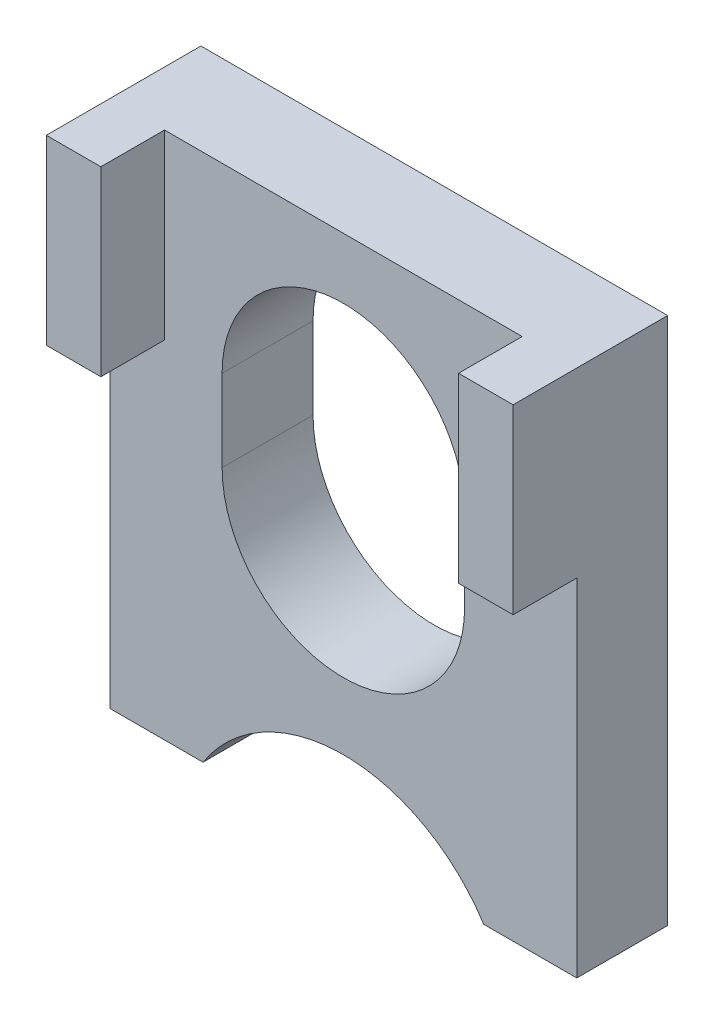
ISO-10303-21;
HEADER;
FILE_DESCRIPTION(('STEP AP214'),'2;1');
FILE_NAME('part.step','',(''),(''),'','','');
FILE_SCHEMA(('AUTOMOTIVE_DESIGN { 1 0 10303 214 1 1 1 1 }'));
ENDSEC;
DATA;
#1=APPLICATION_CONTEXT('core data for automotive mechanical design processes');
#2=APPLICATION_PROTOCOL_DEFINITION('international standard','automotive_design',2000,#1);
#3=PRODUCT_CONTEXT('',#1,'mechanical');
#4=PRODUCT('Part','Part','',(#3));
#5=PRODUCT_RELATED_PRODUCT_CATEGORY('part','',(#4));
#6=PRODUCT_DEFINITION_FORMATION('','',#4);
#7=PRODUCT_DEFINITION_CONTEXT('part definition',#1,'design');
#8=PRODUCT_DEFINITION('design','',#6,#7);
#9=PRODUCT_DEFINITION_SHAPE('','',#8);
#10=(LENGTH_UNIT() NAMED_UNIT(*) SI_UNIT(.MILLI.,.METRE.));
#11=(NAMED_UNIT(*) PLANE_ANGLE_UNIT() SI_UNIT($,.RADIAN.));
#12=(NAMED_UNIT(*) SI_UNIT($,.STERADIAN.) SOLID_ANGLE_UNIT());
#13=UNCERTAINTY_MEASURE_WITH_UNIT(LENGTH_MEASURE(1.E-05),#10,'distance_accuracy_value','');
#14=(GEOMETRIC_REPRESENTATION_CONTEXT(3) GLOBAL_UNCERTAINTY_ASSIGNED_CONTEXT((#13)) GLOBAL_UNIT_ASSIGNED_CONTEXT((#10,
#11,#12)) REPRESENTATION_CONTEXT('',''));
#15=CARTESIAN_POINT('',(0.,0.,0.));
#16=DIRECTION('',(0.,0.,1.));
#17=DIRECTION('',(1.,0.,0.));
#18=AXIS2_PLACEMENT_3D('',#15,#16,#17);
#19=CARTESIAN_POINT('',(0.,-6.65897627091936,3.));
#20=DIRECTION('',(0.,0.,-1.));
#21=DIRECTION('',(-1.,0.,0.));
#22=AXIS2_PLACEMENT_3D('',#19,#20,#21);
#23=PLANE('',#22);
#24=CARTESIAN_POINT('',(0.,7.73749960693732,3.));
#25=DIRECTION('',(0.,0.,1.));
#26=DIRECTION('',(1.,0.,0.));
#27=AXIS2_PLACEMENT_3D('',#24,#25,#26);
#28=CIRCLE('',#27,4.);
#29=CARTESIAN_POINT('',(4.,7.73749960693732,3.));
#30=VERTEX_POINT('',#29);
#31=CARTESIAN_POINT('',(-4.,7.73749960693732,3.));
#32=VERTEX_POINT('',#31);
#33=EDGE_CURVE('E211',#30,#32,#28,.T.);
#34=ORIENTED_EDGE('',*,*,#33,.F.);
#35=DIRECTION('',(0.,1.,0.));
#36=VECTOR('',#35,1.);
#37=CARTESIAN_POINT('',(4.,7.73749960693732,3.));
#38=LINE('',#37,#36);
#39=CARTESIAN_POINT('',(4.,5.04102372908064,3.));
#40=VERTEX_POINT('',#39);
#41=EDGE_CURVE('E219',#40,#30,#38,.T.);
#42=ORIENTED_EDGE('',*,*,#41,.F.);
#43=CARTESIAN_POINT('',(0.,5.04102372908064,3.));
#44=DIRECTION('',(0.,0.,1.));
#45=DIRECTION('',(1.,0.,0.));
#46=AXIS2_PLACEMENT_3D('',#43,#44,#45);
#47=CIRCLE('',#46,4.);
#48=CARTESIAN_POINT('',(-4.,5.04102372908064,3.));
#49=VERTEX_POINT('',#48);
#50=EDGE_CURVE('E216',#49,#40,#47,.T.);
#51=ORIENTED_EDGE('',*,*,#50,.F.);
#52=DIRECTION('',(0.,-1.,0.));
#53=VECTOR('',#52,1.);
#54=CARTESIAN_POINT('',(-4.,7.73749960693732,3.));
#55=LINE('',#54,#53);
#56=EDGE_CURVE('E213',#32,#49,#55,.T.);
#57=ORIENTED_EDGE('',*,*,#56,.F.);
#58=EDGE_LOOP('',(#34,#42,#51,#57));
#59=FACE_BOUND('',#58,.T.);
#60=DIRECTION('',(0.,-1.,0.));
#61=VECTOR('',#60,1.);
#62=CARTESIAN_POINT('',(5.9,13.7374996069373,3.));
#63=LINE('',#62,#61);
#64=CARTESIAN_POINT('',(5.9,13.7374996069373,3.));
#65=VERTEX_POINT('',#64);
#66=CARTESIAN_POINT('',(5.9,7.73749960693732,3.));
#67=VERTEX_POINT('',#66);
#68=EDGE_CURVE('E173',#65,#67,#63,.T.);
#69=ORIENTED_EDGE('',*,*,#68,.F.);
#70=DIRECTION('',(-1.,0.,0.));
#71=VECTOR('',#70,1.);
#72=CARTESIAN_POINT('',(-7.7,13.7374996069373,3.));
#73=LINE('',#72,#71);
#74=CARTESIAN_POINT('',(-5.9,13.7374996069373,3.));
#75=VERTEX_POINT('',#74);
#76=EDGE_CURVE('E252',#65,#75,#73,.T.);
#77=ORIENTED_EDGE('',*,*,#76,.T.);
#78=DIRECTION('',(0.,1.,0.));
#79=VECTOR('',#78,1.);
#80=CARTESIAN_POINT('',(-5.9,13.7374996069373,3.));
#81=LINE('',#80,#79);
#82=CARTESIAN_POINT('',(-5.9,7.73749960693732,3.));
#83=VERTEX_POINT('',#82);
#84=EDGE_CURVE('E190',#83,#75,#81,.T.);
#85=ORIENTED_EDGE('',*,*,#84,.F.);
#86=DIRECTION('',(1.,0.,0.));
#87=VECTOR('',#86,1.);
#88=CARTESIAN_POINT('',(-7.7,7.73749960693732,3.));
#89=LINE('',#88,#87);
#90=CARTESIAN_POINT('',(-7.7,7.73749960693732,3.));
#91=VERTEX_POINT('',#90);
#92=EDGE_CURVE('E185',#91,#83,#89,.T.);
#93=ORIENTED_EDGE('',*,*,#92,.F.);
#94=DIRECTION('',(0.,-1.,0.));
#95=VECTOR('',#94,1.);
#96=CARTESIAN_POINT('',(-7.7,13.7374996069373,3.));
#97=LINE('',#96,#95);
#98=CARTESIAN_POINT('',(-7.7,-3.6899043259227,3.));
#99=VERTEX_POINT('',#98);
#100=EDGE_CURVE('E242',#91,#99,#97,.T.);
#101=ORIENTED_EDGE('',*,*,#100,.T.);
#102=DIRECTION('',(1.,0.,0.));
#103=VECTOR('',#102,1.);
#104=CARTESIAN_POINT('',(-7.7,-3.6899043259227,3.));
#105=LINE('',#104,#103);
#106=CARTESIAN_POINT('',(-4.62975288600091,-3.6899043259227,3.));
#107=VERTEX_POINT('',#106);
#108=EDGE_CURVE('E244',#99,#107,#105,.T.);
#109=ORIENTED_EDGE('',*,*,#108,.T.);
#110=CARTESIAN_POINT('',(0.,-6.65897627091936,3.));
#111=DIRECTION('',(0.,0.,-1.));
#112=DIRECTION('',(-1.,0.,0.));
#113=AXIS2_PLACEMENT_3D('',#110,#111,#112);
#114=CIRCLE('',#113,5.5);
#115=CARTESIAN_POINT('',(4.62975288600091,-3.6899043259227,3.));
#116=VERTEX_POINT('',#115);
#117=EDGE_CURVE('E247',#107,#116,#114,.T.);
#118=ORIENTED_EDGE('',*,*,#117,.T.);
#119=DIRECTION('',(1.,0.,0.));
#120=VECTOR('',#119,1.);
#121=CARTESIAN_POINT('',(7.7,-3.6899043259227,3.));
#122=LINE('',#121,#120);
#123=CARTESIAN_POINT('',(7.7,-3.6899043259227,3.));
#124=VERTEX_POINT('',#123);
#125=EDGE_CURVE('E249',#116,#124,#122,.T.);
#126=ORIENTED_EDGE('',*,*,#125,.T.);
#127=DIRECTION('',(0.,1.,0.));
#128=VECTOR('',#127,1.);
#129=CARTESIAN_POINT('',(7.7,-0.0396047922675049,3.));
#130=LINE('',#129,#128);
#131=CARTESIAN_POINT('',(7.7,7.73749960693732,3.));
#132=VERTEX_POINT('',#131);
#133=EDGE_CURVE('E53',#124,#132,#130,.T.);
#134=ORIENTED_EDGE('',*,*,#133,.T.);
#135=DIRECTION('',(1.,0.,0.));
#136=VECTOR('',#135,1.);
#137=CARTESIAN_POINT('',(7.7,7.73749960693732,3.));
#138=LINE('',#137,#136);
#139=EDGE_CURVE('E48',#67,#132,#138,.T.);
#140=ORIENTED_EDGE('',*,*,#139,.F.);
#141=EDGE_LOOP('',(#69,#77,#85,#93,#101,#109,#118,#126,#134,#140));
#142=FACE_BOUND('',#141,.T.);
#143=ADVANCED_FACE('F33',(#59,#142),#23,.F.);
#144=CARTESIAN_POINT('',(0.,-6.65897627091936,0.));
#145=DIRECTION('',(0.,0.,-1.));
#146=DIRECTION('',(-1.,0.,0.));
#147=AXIS2_PLACEMENT_3D('',#144,#145,#146);
#148=PLANE('',#147);
#149=DIRECTION('',(0.,-1.,0.));
#150=VECTOR('',#149,1.);
#151=CARTESIAN_POINT('',(-7.7,-0.0396047922675089,0.));
#152=LINE('',#151,#150);
#153=CARTESIAN_POINT('',(-7.7,13.7374996069373,0.));
#154=VERTEX_POINT('',#153);
#155=CARTESIAN_POINT('',(-7.7,-3.6899043259227,0.));
#156=VERTEX_POINT('',#155);
#157=EDGE_CURVE('E241',#154,#156,#152,.T.);
#158=ORIENTED_EDGE('',*,*,#157,.F.);
#159=DIRECTION('',(-1.,0.,0.));
#160=VECTOR('',#159,1.);
#161=CARTESIAN_POINT('',(-7.7,13.7374996069373,0.));
#162=LINE('',#161,#160);
#163=CARTESIAN_POINT('',(7.7,13.7374996069373,0.));
#164=VERTEX_POINT('',#163);
#165=EDGE_CURVE('E245',#164,#154,#162,.T.);
#166=ORIENTED_EDGE('',*,*,#165,.F.);
#167=DIRECTION('',(0.,1.,0.));
#168=VECTOR('',#167,1.);
#169=CARTESIAN_POINT('',(7.7,13.7374996069373,0.));
#170=LINE('',#169,#168);
#171=CARTESIAN_POINT('',(7.7,-3.6899043259227,0.));
#172=VERTEX_POINT('',#171);
#173=EDGE_CURVE('E152',#172,#164,#170,.T.);
#174=ORIENTED_EDGE('',*,*,#173,.F.);
#175=DIRECTION('',(1.,0.,0.));
#176=VECTOR('',#175,1.);
#177=CARTESIAN_POINT('',(7.7,-3.6899043259227,0.));
#178=LINE('',#177,#176);
#179=CARTESIAN_POINT('',(4.62975288600091,-3.6899043259227,0.));
#180=VERTEX_POINT('',#179);
#181=EDGE_CURVE('E259',#180,#172,#178,.T.);
#182=ORIENTED_EDGE('',*,*,#181,.F.);
#183=CARTESIAN_POINT('',(0.,-6.65897627091936,0.));
#184=DIRECTION('',(0.,0.,-1.));
#185=DIRECTION('',(-1.,0.,0.));
#186=AXIS2_PLACEMENT_3D('',#183,#184,#185);
#187=CIRCLE('',#186,5.5);
#188=CARTESIAN_POINT('',(-4.62975288600091,-3.6899043259227,0.));
#189=VERTEX_POINT('',#188);
#190=EDGE_CURVE('E257',#189,#180,#187,.T.);
#191=ORIENTED_EDGE('',*,*,#190,.F.);
#192=DIRECTION('',(1.,0.,0.));
#193=VECTOR('',#192,1.);
#194=CARTESIAN_POINT('',(-7.7,-3.6899043259227,0.));
#195=LINE('',#194,#193);
#196=EDGE_CURVE('E255',#156,#189,#195,.T.);
#197=ORIENTED_EDGE('',*,*,#196,.F.);
#198=EDGE_LOOP('',(#158,#166,#174,#182,#191,#197));
#199=FACE_BOUND('',#198,.T.);
#200=DIRECTION('',(0.,1.,0.));
#201=VECTOR('',#200,1.);
#202=CARTESIAN_POINT('',(4.,7.73749960693732,0.));
#203=LINE('',#202,#201);
#204=CARTESIAN_POINT('',(4.,5.04102372908064,0.));
#205=VERTEX_POINT('',#204);
#206=CARTESIAN_POINT('',(4.,7.73749960693732,0.));
#207=VERTEX_POINT('',#206);
#208=EDGE_CURVE('E214',#205,#207,#203,.T.);
#209=ORIENTED_EDGE('',*,*,#208,.T.);
#210=CARTESIAN_POINT('',(0.,7.73749960693732,0.));
#211=DIRECTION('',(0.,0.,1.));
#212=DIRECTION('',(1.,0.,0.));
#213=AXIS2_PLACEMENT_3D('',#210,#211,#212);
#214=CIRCLE('',#213,4.);
#215=CARTESIAN_POINT('',(-4.,7.73749960693732,0.));
#216=VERTEX_POINT('',#215);
#217=EDGE_CURVE('E210',#207,#216,#214,.T.);
#218=ORIENTED_EDGE('',*,*,#217,.T.);
#219=DIRECTION('',(0.,-1.,0.));
#220=VECTOR('',#219,1.);
#221=CARTESIAN_POINT('',(-4.,7.73749960693732,0.));
#222=LINE('',#221,#220);
#223=CARTESIAN_POINT('',(-4.,5.04102372908064,0.));
#224=VERTEX_POINT('',#223);
#225=EDGE_CURVE('E224',#216,#224,#222,.T.);
#226=ORIENTED_EDGE('',*,*,#225,.T.);
#227=CARTESIAN_POINT('',(0.,5.04102372908064,0.));
#228=DIRECTION('',(0.,0.,1.));
#229=DIRECTION('',(1.,0.,0.));
#230=AXIS2_PLACEMENT_3D('',#227,#228,#229);
#231=CIRCLE('',#230,4.);
#232=EDGE_CURVE('E227',#224,#205,#231,.T.);
#233=ORIENTED_EDGE('',*,*,#232,.T.);
#234=EDGE_LOOP('',(#209,#218,#226,#233));
#235=FACE_BOUND('',#234,.T.);
#236=ADVANCED_FACE('F281',(#199,#235),#148,.T.);
#237=CARTESIAN_POINT('',(-7.7,-0.0396047922675089,3.));
#238=DIRECTION('',(1.,0.,0.));
#239=DIRECTION('',(0.,1.,0.));
#240=AXIS2_PLACEMENT_3D('',#237,#238,#239);
#241=PLANE('',#240);
#242=ORIENTED_EDGE('',*,*,#157,.T.);
#243=DIRECTION('',(0.,0.,-1.));
#244=VECTOR('',#243,1.);
#245=CARTESIAN_POINT('',(-7.7,-3.6899043259227,3.));
#246=LINE('',#245,#244);
#247=EDGE_CURVE('E11',#99,#156,#246,.T.);
#248=ORIENTED_EDGE('',*,*,#247,.F.);
#249=ORIENTED_EDGE('',*,*,#100,.F.);
#250=DIRECTION('',(0.,0.,-1.));
#251=VECTOR('',#250,1.);
#252=CARTESIAN_POINT('',(-7.7,7.73749960693732,5.1));
#253=LINE('',#252,#251);
#254=CARTESIAN_POINT('',(-7.7,7.73749960693732,5.1));
#255=VERTEX_POINT('',#254);
#256=EDGE_CURVE('E207',#255,#91,#253,.T.);
#257=ORIENTED_EDGE('',*,*,#256,.F.);
#258=DIRECTION('',(0.,-1.,0.));
#259=VECTOR('',#258,1.);
#260=CARTESIAN_POINT('',(-7.7,13.7374996069373,5.1));
#261=LINE('',#260,#259);
#262=CARTESIAN_POINT('',(-7.7,13.7374996069373,5.1));
#263=VERTEX_POINT('',#262);
#264=EDGE_CURVE('E186',#263,#255,#261,.T.);
#265=ORIENTED_EDGE('',*,*,#264,.F.);
#266=DIRECTION('',(0.,0.,-1.));
#267=VECTOR('',#266,1.);
#268=CARTESIAN_POINT('',(-7.7,13.7374996069373,3.));
#269=LINE('',#268,#267);
#270=EDGE_CURVE('E157',#263,#154,#269,.T.);
#271=ORIENTED_EDGE('',*,*,#270,.T.);
#272=EDGE_LOOP('',(#242,#248,#249,#257,#265,#271));
#273=FACE_BOUND('',#272,.T.);
#274=ADVANCED_FACE('F35',(#273),#241,.F.);
#275=CARTESIAN_POINT('',(-7.7,-3.6899043259227,3.));
#276=DIRECTION('',(0.,1.,0.));
#277=DIRECTION('',(0.,0.,1.));
#278=AXIS2_PLACEMENT_3D('',#275,#276,#277);
#279=PLANE('',#278);
#280=ORIENTED_EDGE('',*,*,#196,.T.);
#281=DIRECTION('',(0.,0.,-1.));
#282=VECTOR('',#281,1.);
#283=CARTESIAN_POINT('',(-4.62975288600091,-3.6899043259227,3.));
#284=LINE('',#283,#282);
#285=EDGE_CURVE('E41',#107,#189,#284,.T.);
#286=ORIENTED_EDGE('',*,*,#285,.F.);
#287=ORIENTED_EDGE('',*,*,#108,.F.);
#288=ORIENTED_EDGE('',*,*,#247,.T.);
#289=EDGE_LOOP('',(#280,#286,#287,#288));
#290=FACE_BOUND('',#289,.T.);
#291=ADVANCED_FACE('F307',(#290),#279,.F.);
#292=CARTESIAN_POINT('',(0.,-6.65897627091936,3.));
#293=DIRECTION('',(0.,0.,-1.));
#294=DIRECTION('',(-1.,0.,0.));
#295=AXIS2_PLACEMENT_3D('',#292,#293,#294);
#296=CYLINDRICAL_SURFACE('',#295,5.5);
#297=ORIENTED_EDGE('',*,*,#190,.T.);
#298=DIRECTION('',(0.,0.,-1.));
#299=VECTOR('',#298,1.);
#300=CARTESIAN_POINT('',(4.62975288600091,-3.6899043259227,3.));
#301=LINE('',#300,#299);
#302=EDGE_CURVE('E267',#116,#180,#301,.T.);
#303=ORIENTED_EDGE('',*,*,#302,.F.);
#304=ORIENTED_EDGE('',*,*,#117,.F.);
#305=ORIENTED_EDGE('',*,*,#285,.T.);
#306=EDGE_LOOP('',(#297,#303,#304,#305));
#307=FACE_BOUND('',#306,.T.);
#308=ADVANCED_FACE('F274',(#307),#296,.F.);
#309=CARTESIAN_POINT('',(7.7,-3.6899043259227,3.));
#310=DIRECTION('',(0.,1.,0.));
#311=DIRECTION('',(-1.,0.,0.));
#312=AXIS2_PLACEMENT_3D('',#309,#310,#311);
#313=PLANE('',#312);
#314=ORIENTED_EDGE('',*,*,#181,.T.);
#315=DIRECTION('',(0.,0.,-1.));
#316=VECTOR('',#315,1.);
#317=CARTESIAN_POINT('',(7.7,-3.6899043259227,3.));
#318=LINE('',#317,#316);
#319=EDGE_CURVE('E156',#124,#172,#318,.T.);
#320=ORIENTED_EDGE('',*,*,#319,.F.);
#321=ORIENTED_EDGE('',*,*,#125,.F.);
#322=ORIENTED_EDGE('',*,*,#302,.T.);
#323=EDGE_LOOP('',(#314,#320,#321,#322));
#324=FACE_BOUND('',#323,.T.);
#325=ADVANCED_FACE('F285',(#324),#313,.F.);
#326=CARTESIAN_POINT('',(7.7,13.7374996069373,3.));
#327=DIRECTION('',(-1.,0.,0.));
#328=DIRECTION('',(0.,-1.,0.));
#329=AXIS2_PLACEMENT_3D('',#326,#327,#328);
#330=PLANE('',#329);
#331=ORIENTED_EDGE('',*,*,#173,.T.);
#332=DIRECTION('',(0.,0.,-1.));
#333=VECTOR('',#332,1.);
#334=CARTESIAN_POINT('',(7.7,13.7374996069373,3.));
#335=LINE('',#334,#333);
#336=CARTESIAN_POINT('',(7.7,13.7374996069373,5.1));
#337=VERTEX_POINT('',#336);
#338=EDGE_CURVE('E145',#337,#164,#335,.T.);
#339=ORIENTED_EDGE('',*,*,#338,.F.);
#340=DIRECTION('',(0.,1.,0.));
#341=VECTOR('',#340,1.);
#342=CARTESIAN_POINT('',(7.7,13.7374996069373,5.1));
#343=LINE('',#342,#341);
#344=CARTESIAN_POINT('',(7.7,7.73749960693732,5.1));
#345=VERTEX_POINT('',#344);
#346=EDGE_CURVE('E150',#345,#337,#343,.T.);
#347=ORIENTED_EDGE('',*,*,#346,.F.);
#348=DIRECTION('',(0.,0.,-1.));
#349=VECTOR('',#348,1.);
#350=CARTESIAN_POINT('',(7.7,7.73749960693732,5.1));
#351=LINE('',#350,#349);
#352=EDGE_CURVE('E178',#345,#132,#351,.T.);
#353=ORIENTED_EDGE('',*,*,#352,.T.);
#354=ORIENTED_EDGE('',*,*,#133,.F.);
#355=ORIENTED_EDGE('',*,*,#319,.T.);
#356=EDGE_LOOP('',(#331,#339,#347,#353,#354,#355));
#357=FACE_BOUND('',#356,.T.);
#358=ADVANCED_FACE('F147',(#357),#330,.F.);
#359=CARTESIAN_POINT('',(-7.7,13.7374996069373,3.));
#360=DIRECTION('',(0.,-1.,0.));
#361=DIRECTION('',(0.,0.,-1.));
#362=AXIS2_PLACEMENT_3D('',#359,#360,#361);
#363=PLANE('',#362);
#364=ORIENTED_EDGE('',*,*,#165,.T.);
#365=ORIENTED_EDGE('',*,*,#270,.F.);
#366=DIRECTION('',(-1.,0.,0.));
#367=VECTOR('',#366,1.);
#368=CARTESIAN_POINT('',(-7.7,13.7374996069373,5.1));
#369=LINE('',#368,#367);
#370=CARTESIAN_POINT('',(-5.9,13.7374996069373,5.1));
#371=VERTEX_POINT('',#370);
#372=EDGE_CURVE('E194',#371,#263,#369,.T.);
#373=ORIENTED_EDGE('',*,*,#372,.F.);
#374=DIRECTION('',(0.,0.,-1.));
#375=VECTOR('',#374,1.);
#376=CARTESIAN_POINT('',(-5.9,13.7374996069373,5.1));
#377=LINE('',#376,#375);
#378=EDGE_CURVE('E197',#371,#75,#377,.T.);
#379=ORIENTED_EDGE('',*,*,#378,.T.);
#380=ORIENTED_EDGE('',*,*,#76,.F.);
#381=DIRECTION('',(0.,0.,-1.));
#382=VECTOR('',#381,1.);
#383=CARTESIAN_POINT('',(5.9,13.7374996069373,5.1));
#384=LINE('',#383,#382);
#385=CARTESIAN_POINT('',(5.9,13.7374996069373,5.1));
#386=VERTEX_POINT('',#385);
#387=EDGE_CURVE('E163',#386,#65,#384,.T.);
#388=ORIENTED_EDGE('',*,*,#387,.F.);
#389=DIRECTION('',(-1.,0.,0.));
#390=VECTOR('',#389,1.);
#391=CARTESIAN_POINT('',(7.7,13.7374996069373,5.1));
#392=LINE('',#391,#390);
#393=EDGE_CURVE('E160',#337,#386,#392,.T.);
#394=ORIENTED_EDGE('',*,*,#393,.F.);
#395=ORIENTED_EDGE('',*,*,#338,.T.);
#396=EDGE_LOOP('',(#364,#365,#373,#379,#380,#388,#394,#395));
#397=FACE_BOUND('',#396,.T.);
#398=ADVANCED_FACE('F161',(#397),#363,.F.);
#399=CARTESIAN_POINT('',(0.,7.73749960693732,3.));
#400=DIRECTION('',(0.,0.,-1.));
#401=DIRECTION('',(-1.,0.,0.));
#402=AXIS2_PLACEMENT_3D('',#399,#400,#401);
#403=CYLINDRICAL_SURFACE('',#402,4.);
#404=ORIENTED_EDGE('',*,*,#217,.F.);
#405=DIRECTION('',(0.,0.,-1.));
#406=VECTOR('',#405,1.);
#407=CARTESIAN_POINT('',(4.,7.73749960693732,3.));
#408=LINE('',#407,#406);
#409=EDGE_CURVE('E221',#30,#207,#408,.T.);
#410=ORIENTED_EDGE('',*,*,#409,.F.);
#411=ORIENTED_EDGE('',*,*,#33,.T.);
#412=DIRECTION('',(0.,0.,-1.));
#413=VECTOR('',#412,1.);
#414=CARTESIAN_POINT('',(-4.,7.73749960693732,3.));
#415=LINE('',#414,#413);
#416=EDGE_CURVE('E238',#32,#216,#415,.T.);
#417=ORIENTED_EDGE('',*,*,#416,.T.);
#418=EDGE_LOOP('',(#404,#410,#411,#417));
#419=FACE_BOUND('',#418,.T.);
#420=ADVANCED_FACE('F323',(#419),#403,.F.);
#421=CARTESIAN_POINT('',(-4.,7.73749960693732,3.));
#422=DIRECTION('',(1.,0.,0.));
#423=DIRECTION('',(0.,1.,0.));
#424=AXIS2_PLACEMENT_3D('',#421,#422,#423);
#425=PLANE('',#424);
#426=ORIENTED_EDGE('',*,*,#225,.F.);
#427=ORIENTED_EDGE('',*,*,#416,.F.);
#428=ORIENTED_EDGE('',*,*,#56,.T.);
#429=DIRECTION('',(0.,0.,-1.));
#430=VECTOR('',#429,1.);
#431=CARTESIAN_POINT('',(-4.,5.04102372908064,3.));
#432=LINE('',#431,#430);
#433=EDGE_CURVE('E236',#49,#224,#432,.T.);
#434=ORIENTED_EDGE('',*,*,#433,.T.);
#435=EDGE_LOOP('',(#426,#427,#428,#434));
#436=FACE_BOUND('',#435,.T.);
#437=ADVANCED_FACE('F351',(#436),#425,.T.);
#438=CARTESIAN_POINT('',(0.,5.04102372908064,3.));
#439=DIRECTION('',(0.,0.,-1.));
#440=DIRECTION('',(-1.,0.,0.));
#441=AXIS2_PLACEMENT_3D('',#438,#439,#440);
#442=CYLINDRICAL_SURFACE('',#441,4.);
#443=ORIENTED_EDGE('',*,*,#232,.F.);
#444=ORIENTED_EDGE('',*,*,#433,.F.);
#445=ORIENTED_EDGE('',*,*,#50,.T.);
#446=DIRECTION('',(0.,0.,-1.));
#447=VECTOR('',#446,1.);
#448=CARTESIAN_POINT('',(4.,5.04102372908064,3.));
#449=LINE('',#448,#447);
#450=EDGE_CURVE('E234',#40,#205,#449,.T.);
#451=ORIENTED_EDGE('',*,*,#450,.T.);
#452=EDGE_LOOP('',(#443,#444,#445,#451));
#453=FACE_BOUND('',#452,.T.);
#454=ADVANCED_FACE('F358',(#453),#442,.F.);
#455=CARTESIAN_POINT('',(4.,7.73749960693732,3.));
#456=DIRECTION('',(-1.,0.,0.));
#457=DIRECTION('',(0.,-1.,0.));
#458=AXIS2_PLACEMENT_3D('',#455,#456,#457);
#459=PLANE('',#458);
#460=ORIENTED_EDGE('',*,*,#208,.F.);
#461=ORIENTED_EDGE('',*,*,#450,.F.);
#462=ORIENTED_EDGE('',*,*,#41,.T.);
#463=ORIENTED_EDGE('',*,*,#409,.T.);
#464=EDGE_LOOP('',(#460,#461,#462,#463));
#465=FACE_BOUND('',#464,.T.);
#466=ADVANCED_FACE('F365',(#465),#459,.T.);
#467=CARTESIAN_POINT('',(-7.7,7.73749960693732,5.1));
#468=DIRECTION('',(0.,1.,0.));
#469=DIRECTION('',(0.,0.,1.));
#470=AXIS2_PLACEMENT_3D('',#467,#468,#469);
#471=PLANE('',#470);
#472=ORIENTED_EDGE('',*,*,#92,.T.);
#473=DIRECTION('',(0.,0.,-1.));
#474=VECTOR('',#473,1.);
#475=CARTESIAN_POINT('',(-5.9,7.73749960693732,5.1));
#476=LINE('',#475,#474);
#477=CARTESIAN_POINT('',(-5.9,7.73749960693732,5.1));
#478=VERTEX_POINT('',#477);
#479=EDGE_CURVE('E204',#478,#83,#476,.T.);
#480=ORIENTED_EDGE('',*,*,#479,.F.);
#481=DIRECTION('',(1.,0.,0.));
#482=VECTOR('',#481,1.);
#483=CARTESIAN_POINT('',(-7.7,7.73749960693732,5.1));
#484=LINE('',#483,#482);
#485=EDGE_CURVE('E189',#255,#478,#484,.T.);
#486=ORIENTED_EDGE('',*,*,#485,.F.);
#487=ORIENTED_EDGE('',*,*,#256,.T.);
#488=EDGE_LOOP('',(#472,#480,#486,#487));
#489=FACE_BOUND('',#488,.T.);
#490=ADVANCED_FACE('F306',(#489),#471,.F.);
#491=CARTESIAN_POINT('',(-5.9,13.7374996069373,5.1));
#492=DIRECTION('',(-1.,0.,0.));
#493=DIRECTION('',(0.,-1.,0.));
#494=AXIS2_PLACEMENT_3D('',#491,#492,#493);
#495=PLANE('',#494);
#496=ORIENTED_EDGE('',*,*,#84,.T.);
#497=ORIENTED_EDGE('',*,*,#378,.F.);
#498=DIRECTION('',(0.,1.,0.));
#499=VECTOR('',#498,1.);
#500=CARTESIAN_POINT('',(-5.9,13.7374996069373,5.1));
#501=LINE('',#500,#499);
#502=EDGE_CURVE('E192',#478,#371,#501,.T.);
#503=ORIENTED_EDGE('',*,*,#502,.F.);
#504=ORIENTED_EDGE('',*,*,#479,.T.);
#505=EDGE_LOOP('',(#496,#497,#503,#504));
#506=FACE_BOUND('',#505,.T.);
#507=ADVANCED_FACE('F294',(#506),#495,.F.);
#508=CARTESIAN_POINT('',(0.,0.,5.1));
#509=DIRECTION('',(0.,0.,1.));
#510=DIRECTION('',(1.,0.,0.));
#511=AXIS2_PLACEMENT_3D('',#508,#509,#510);
#512=PLANE('',#511);
#513=ORIENTED_EDGE('',*,*,#264,.T.);
#514=ORIENTED_EDGE('',*,*,#485,.T.);
#515=ORIENTED_EDGE('',*,*,#502,.T.);
#516=ORIENTED_EDGE('',*,*,#372,.T.);
#517=EDGE_LOOP('',(#513,#514,#515,#516));
#518=FACE_BOUND('',#517,.T.);
#519=ADVANCED_FACE('F300',(#518),#512,.T.);
#520=CARTESIAN_POINT('',(5.9,13.7374996069373,5.1));
#521=DIRECTION('',(1.,0.,0.));
#522=DIRECTION('',(0.,1.,0.));
#523=AXIS2_PLACEMENT_3D('',#520,#521,#522);
#524=PLANE('',#523);
#525=ORIENTED_EDGE('',*,*,#68,.T.);
#526=DIRECTION('',(0.,0.,-1.));
#527=VECTOR('',#526,1.);
#528=CARTESIAN_POINT('',(5.9,7.73749960693732,5.1));
#529=LINE('',#528,#527);
#530=CARTESIAN_POINT('',(5.9,7.73749960693732,5.1));
#531=VERTEX_POINT('',#530);
#532=EDGE_CURVE('E181',#531,#67,#529,.T.);
#533=ORIENTED_EDGE('',*,*,#532,.F.);
#534=DIRECTION('',(0.,-1.,0.));
#535=VECTOR('',#534,1.);
#536=CARTESIAN_POINT('',(5.9,13.7374996069373,5.1));
#537=LINE('',#536,#535);
#538=EDGE_CURVE('E166',#386,#531,#537,.T.);
#539=ORIENTED_EDGE('',*,*,#538,.F.);
#540=ORIENTED_EDGE('',*,*,#387,.T.);
#541=EDGE_LOOP('',(#525,#533,#539,#540));
#542=FACE_BOUND('',#541,.T.);
#543=ADVANCED_FACE('F291',(#542),#524,.F.);
#544=CARTESIAN_POINT('',(7.7,7.73749960693732,5.1));
#545=DIRECTION('',(0.,1.,0.));
#546=DIRECTION('',(0.,0.,1.));
#547=AXIS2_PLACEMENT_3D('',#544,#545,#546);
#548=PLANE('',#547);
#549=ORIENTED_EDGE('',*,*,#139,.T.);
#550=ORIENTED_EDGE('',*,*,#352,.F.);
#551=DIRECTION('',(1.,0.,0.));
#552=VECTOR('',#551,1.);
#553=CARTESIAN_POINT('',(7.7,7.73749960693732,5.1));
#554=LINE('',#553,#552);
#555=EDGE_CURVE('E170',#531,#345,#554,.T.);
#556=ORIENTED_EDGE('',*,*,#555,.F.);
#557=ORIENTED_EDGE('',*,*,#532,.T.);
#558=EDGE_LOOP('',(#549,#550,#556,#557));
#559=FACE_BOUND('',#558,.T.);
#560=ADVANCED_FACE('F288',(#559),#548,.F.);
#561=CARTESIAN_POINT('',(0.,0.,5.1));
#562=DIRECTION('',(0.,0.,-1.));
#563=DIRECTION('',(-1.,0.,0.));
#564=AXIS2_PLACEMENT_3D('',#561,#562,#563);
#565=PLANE('',#564);
#566=ORIENTED_EDGE('',*,*,#346,.T.);
#567=ORIENTED_EDGE('',*,*,#393,.T.);
#568=ORIENTED_EDGE('',*,*,#538,.T.);
#569=ORIENTED_EDGE('',*,*,#555,.T.);
#570=EDGE_LOOP('',(#566,#567,#568,#569));
#571=FACE_BOUND('',#570,.T.);
#572=ADVANCED_FACE('F168',(#571),#565,.F.);
#573=CLOSED_SHELL('',(#143,#236,#274,#291,#308,#325,#358,#398,#420,#437,#454,#466,#490,#507,
#519,#543,#560,#572));
#574=MANIFOLD_SOLID_BREP('B2',#573);
#575=ADVANCED_BREP_SHAPE_REPRESENTATION('',(#18,#574),#14);
#576=SHAPE_DEFINITION_REPRESENTATION(#9,#575);
ENDSEC;
END-ISO-10303-21;
